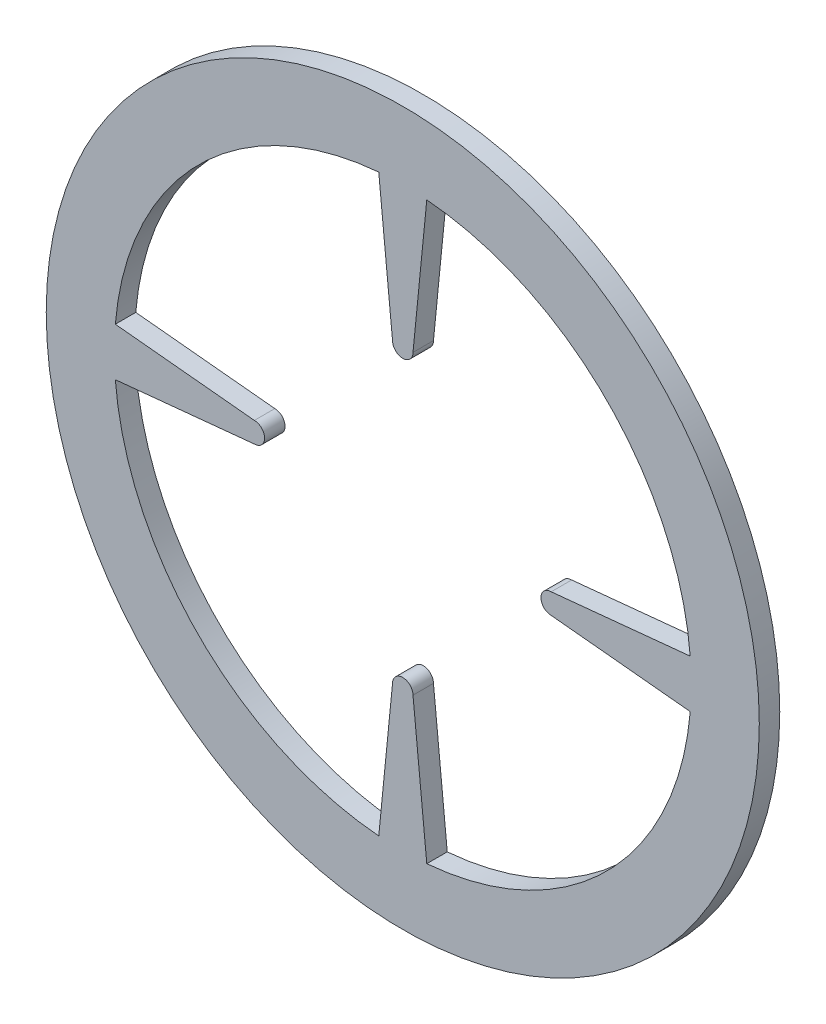
ISO-10303-21;
HEADER;
FILE_DESCRIPTION(('STEP AP214'),'2;1');
FILE_NAME('part.step','',(''),(''),'','','');
FILE_SCHEMA(('AUTOMOTIVE_DESIGN { 1 0 10303 214 1 1 1 1 }'));
ENDSEC;
DATA;
#1=APPLICATION_CONTEXT('core data for automotive mechanical design processes');
#2=APPLICATION_PROTOCOL_DEFINITION('international standard','automotive_design',2000,#1);
#3=PRODUCT_CONTEXT('',#1,'mechanical');
#4=PRODUCT('Part','Part','',(#3));
#5=PRODUCT_RELATED_PRODUCT_CATEGORY('part','',(#4));
#6=PRODUCT_DEFINITION_FORMATION('','',#4);
#7=PRODUCT_DEFINITION_CONTEXT('part definition',#1,'design');
#8=PRODUCT_DEFINITION('design','',#6,#7);
#9=PRODUCT_DEFINITION_SHAPE('','',#8);
#10=(LENGTH_UNIT() NAMED_UNIT(*) SI_UNIT(.MILLI.,.METRE.));
#11=(NAMED_UNIT(*) PLANE_ANGLE_UNIT() SI_UNIT($,.RADIAN.));
#12=(NAMED_UNIT(*) SI_UNIT($,.STERADIAN.) SOLID_ANGLE_UNIT());
#13=UNCERTAINTY_MEASURE_WITH_UNIT(LENGTH_MEASURE(1.E-05),#10,'distance_accuracy_value','');
#14=(GEOMETRIC_REPRESENTATION_CONTEXT(3) GLOBAL_UNCERTAINTY_ASSIGNED_CONTEXT((#13)) GLOBAL_UNIT_ASSIGNED_CONTEXT((#10,
#11,#12)) REPRESENTATION_CONTEXT('',''));
#15=CARTESIAN_POINT('',(0.,0.,0.));
#16=DIRECTION('',(0.,0.,1.));
#17=DIRECTION('',(1.,0.,0.));
#18=AXIS2_PLACEMENT_3D('',#15,#16,#17);
#19=CARTESIAN_POINT('',(0.,0.,0.06));
#20=DIRECTION('',(0.,0.,-1.));
#21=DIRECTION('',(-1.,0.,0.));
#22=AXIS2_PLACEMENT_3D('',#19,#20,#21);
#23=CYLINDRICAL_SURFACE('',#22,1.045);
#24=CARTESIAN_POINT('',(0.,0.,0.06));
#25=DIRECTION('',(0.,0.,1.));
#26=DIRECTION('',(1.,0.,0.));
#27=AXIS2_PLACEMENT_3D('',#24,#25,#26);
#28=CIRCLE('',#27,1.045);
#29=CARTESIAN_POINT('',(1.045,0.,0.06));
#30=VERTEX_POINT('',#29);
#31=EDGE_CURVE('E277',#30,#30,#28,.T.);
#32=ORIENTED_EDGE('',*,*,#31,.F.);
#33=EDGE_LOOP('',(#32));
#34=FACE_BOUND('',#33,.T.);
#35=CARTESIAN_POINT('',(0.,0.,0.));
#36=DIRECTION('',(0.,0.,1.));
#37=DIRECTION('',(1.,0.,0.));
#38=AXIS2_PLACEMENT_3D('',#35,#36,#37);
#39=CIRCLE('',#38,1.045);
#40=CARTESIAN_POINT('',(1.045,0.,0.));
#41=VERTEX_POINT('',#40);
#42=EDGE_CURVE('E265',#41,#41,#39,.T.);
#43=ORIENTED_EDGE('',*,*,#42,.T.);
#44=EDGE_LOOP('',(#43));
#45=FACE_BOUND('',#44,.T.);
#46=ADVANCED_FACE('F88',(#34,#45),#23,.T.);
#47=CARTESIAN_POINT('',(-0.01298454081632,-0.00128687487735681,0.06));
#48=DIRECTION('',(0.995124665732408,0.0986250457589971,0.));
#49=DIRECTION('',(-0.0986250457589971,0.995124665732408,0.));
#50=AXIS2_PLACEMENT_3D('',#47,#48,#49);
#51=PLANE('',#50);
#52=DIRECTION('',(0.0986250457589971,-0.995124665732408,0.));
#53=VECTOR('',#52,1.);
#54=CARTESIAN_POINT('',(-0.01298454081632,-0.00128687487735681,0.));
#55=LINE('',#54,#53);
#56=CARTESIAN_POINT('',(0.0299999999999969,-0.435000000000001,0.));
#57=VERTEX_POINT('',#56);
#58=CARTESIAN_POINT('',(0.0703881485507596,-0.842515581025341,0.));
#59=VERTEX_POINT('',#58);
#60=EDGE_CURVE('E283',#57,#59,#55,.T.);
#61=ORIENTED_EDGE('',*,*,#60,.F.);
#62=DIRECTION('',(0.,0.,-1.));
#63=VECTOR('',#62,1.);
#64=CARTESIAN_POINT('',(0.0299999999999969,-0.435000000000001,0.06));
#65=LINE('',#64,#63);
#66=CARTESIAN_POINT('',(0.0299999999999969,-0.435000000000001,0.06));
#67=VERTEX_POINT('',#66);
#68=EDGE_CURVE('E197',#67,#57,#65,.T.);
#69=ORIENTED_EDGE('',*,*,#68,.F.);
#70=DIRECTION('',(0.0986250457589971,-0.995124665732408,0.));
#71=VECTOR('',#70,1.);
#72=CARTESIAN_POINT('',(-0.01298454081632,-0.00128687487735681,0.06));
#73=LINE('',#72,#71);
#74=CARTESIAN_POINT('',(0.0703881485507596,-0.842515581025341,0.06));
#75=VERTEX_POINT('',#74);
#76=EDGE_CURVE('E268',#67,#75,#73,.T.);
#77=ORIENTED_EDGE('',*,*,#76,.T.);
#78=DIRECTION('',(0.,0.,-1.));
#79=VECTOR('',#78,1.);
#80=CARTESIAN_POINT('',(0.0703881485507596,-0.842515581025341,0.06));
#81=LINE('',#80,#79);
#82=EDGE_CURVE('E194',#75,#59,#81,.T.);
#83=ORIENTED_EDGE('',*,*,#82,.T.);
#84=EDGE_LOOP('',(#61,#69,#77,#83));
#85=FACE_BOUND('',#84,.T.);
#86=ADVANCED_FACE('F315',(#85),#51,.T.);
#87=CARTESIAN_POINT('',(0.,-0.435000000000001,0.06));
#88=DIRECTION('',(0.,0.,-1.));
#89=DIRECTION('',(-1.,0.,0.));
#90=AXIS2_PLACEMENT_3D('',#87,#88,#89);
#91=CYLINDRICAL_SURFACE('',#90,0.03);
#92=CARTESIAN_POINT('',(0.,-0.435000000000001,0.));
#93=DIRECTION('',(0.,0.,1.));
#94=DIRECTION('',(1.,0.,0.));
#95=AXIS2_PLACEMENT_3D('',#92,#93,#94);
#96=CIRCLE('',#95,0.03);
#97=CARTESIAN_POINT('',(-0.030000000000003,-0.435000000000001,0.));
#98=VERTEX_POINT('',#97);
#99=EDGE_CURVE('E287',#57,#98,#96,.T.);
#100=ORIENTED_EDGE('',*,*,#99,.T.);
#101=DIRECTION('',(0.,0.,-1.));
#102=VECTOR('',#101,1.);
#103=CARTESIAN_POINT('',(-0.030000000000003,-0.435000000000001,0.06));
#104=LINE('',#103,#102);
#105=CARTESIAN_POINT('',(-0.030000000000003,-0.435000000000001,0.06));
#106=VERTEX_POINT('',#105);
#107=EDGE_CURVE('E297',#106,#98,#104,.T.);
#108=ORIENTED_EDGE('',*,*,#107,.F.);
#109=CARTESIAN_POINT('',(0.,-0.435000000000001,0.06));
#110=DIRECTION('',(0.,0.,1.));
#111=DIRECTION('',(1.,0.,0.));
#112=AXIS2_PLACEMENT_3D('',#109,#110,#111);
#113=CIRCLE('',#112,0.03);
#114=EDGE_CURVE('E271',#67,#106,#113,.T.);
#115=ORIENTED_EDGE('',*,*,#114,.F.);
#116=ORIENTED_EDGE('',*,*,#68,.T.);
#117=EDGE_LOOP('',(#100,#108,#115,#116));
#118=FACE_BOUND('',#117,.T.);
#119=ADVANCED_FACE('F305',(#118),#91,.T.);
#120=CARTESIAN_POINT('',(0.01298454081632,-0.00128687487735699,0.06));
#121=DIRECTION('',(0.995124665732406,-0.098625045759011,0.));
#122=DIRECTION('',(0.098625045759011,0.995124665732406,0.));
#123=AXIS2_PLACEMENT_3D('',#120,#121,#122);
#124=PLANE('',#123);
#125=DIRECTION('',(-0.098625045759011,-0.995124665732406,0.));
#126=VECTOR('',#125,1.);
#127=CARTESIAN_POINT('',(0.01298454081632,-0.00128687487735699,0.));
#128=LINE('',#127,#126);
#129=CARTESIAN_POINT('',(-0.0703881485507713,-0.84251558102534,0.));
#130=VERTEX_POINT('',#129);
#131=EDGE_CURVE('E290',#98,#130,#128,.T.);
#132=ORIENTED_EDGE('',*,*,#131,.T.);
#133=DIRECTION('',(0.,0.,-1.));
#134=VECTOR('',#133,1.);
#135=CARTESIAN_POINT('',(-0.0703881485507713,-0.84251558102534,0.06));
#136=LINE('',#135,#134);
#137=CARTESIAN_POINT('',(-0.0703881485507713,-0.84251558102534,0.06));
#138=VERTEX_POINT('',#137);
#139=EDGE_CURVE('E280',#138,#130,#136,.T.);
#140=ORIENTED_EDGE('',*,*,#139,.F.);
#141=DIRECTION('',(-0.098625045759011,-0.995124665732406,0.));
#142=VECTOR('',#141,1.);
#143=CARTESIAN_POINT('',(0.01298454081632,-0.00128687487735699,0.06));
#144=LINE('',#143,#142);
#145=EDGE_CURVE('E274',#106,#138,#144,.T.);
#146=ORIENTED_EDGE('',*,*,#145,.F.);
#147=ORIENTED_EDGE('',*,*,#107,.T.);
#148=EDGE_LOOP('',(#132,#140,#146,#147));
#149=FACE_BOUND('',#148,.T.);
#150=ADVANCED_FACE('F383',(#149),#124,.F.);
#151=CARTESIAN_POINT('',(0.,0.,0.06));
#152=DIRECTION('',(0.,0.,-1.));
#153=DIRECTION('',(-1.,0.,0.));
#154=AXIS2_PLACEMENT_3D('',#151,#152,#153);
#155=CYLINDRICAL_SURFACE('',#154,0.845450764815357);
#156=DIRECTION('',(0.,0.,-1.));
#157=VECTOR('',#156,1.);
#158=CARTESIAN_POINT('',(-0.842515581025341,-0.0703881485507566,0.06));
#159=LINE('',#158,#157);
#160=CARTESIAN_POINT('',(-0.842515581025341,-0.0703881485507566,0.06));
#161=VERTEX_POINT('',#160);
#162=CARTESIAN_POINT('',(-0.842515581025342,-0.0703881485507564,0.));
#163=VERTEX_POINT('',#162);
#164=EDGE_CURVE('E98',#161,#163,#159,.T.);
#165=ORIENTED_EDGE('',*,*,#164,.F.);
#166=CARTESIAN_POINT('',(0.,0.,0.06));
#167=DIRECTION('',(0.,0.,1.));
#168=DIRECTION('',(1.,0.,0.));
#169=AXIS2_PLACEMENT_3D('',#166,#167,#168);
#170=CIRCLE('',#169,0.845450764815357);
#171=EDGE_CURVE('E262',#161,#138,#170,.T.);
#172=ORIENTED_EDGE('',*,*,#171,.T.);
#173=ORIENTED_EDGE('',*,*,#139,.T.);
#174=CARTESIAN_POINT('',(0.,0.,0.));
#175=DIRECTION('',(0.,0.,1.));
#176=DIRECTION('',(1.,0.,0.));
#177=AXIS2_PLACEMENT_3D('',#174,#175,#176);
#178=CIRCLE('',#177,0.845450764815357);
#179=EDGE_CURVE('E225',#163,#130,#178,.T.);
#180=ORIENTED_EDGE('',*,*,#179,.F.);
#181=EDGE_LOOP('',(#165,#172,#173,#180));
#182=FACE_BOUND('',#181,.T.);
#183=ADVANCED_FACE('F386',(#182),#155,.F.);
#184=CARTESIAN_POINT('',(-0.0703881485507654,0.842515581025341,0.06));
#185=VERTEX_POINT('',#184);
#186=CARTESIAN_POINT('',(-0.84251558102534,0.0703881485507743,0.06));
#187=VERTEX_POINT('',#186);
#188=EDGE_CURVE('E256',#185,#187,#170,.T.);
#189=ORIENTED_EDGE('',*,*,#188,.T.);
#190=DIRECTION('',(0.,0.,-1.));
#191=VECTOR('',#190,1.);
#192=CARTESIAN_POINT('',(-0.84251558102534,0.0703881485507743,0.06));
#193=LINE('',#192,#191);
#194=CARTESIAN_POINT('',(-0.84251558102534,0.0703881485507743,0.));
#195=VERTEX_POINT('',#194);
#196=EDGE_CURVE('E12',#187,#195,#193,.T.);
#197=ORIENTED_EDGE('',*,*,#196,.T.);
#198=CARTESIAN_POINT('',(-0.0703881485507655,0.842515581025341,0.));
#199=VERTEX_POINT('',#198);
#200=EDGE_CURVE('E415',#199,#195,#178,.T.);
#201=ORIENTED_EDGE('',*,*,#200,.F.);
#202=DIRECTION('',(0.,0.,-1.));
#203=VECTOR('',#202,1.);
#204=CARTESIAN_POINT('',(-0.0703881485507654,0.842515581025341,0.06));
#205=LINE('',#204,#203);
#206=EDGE_CURVE('E178',#185,#199,#205,.T.);
#207=ORIENTED_EDGE('',*,*,#206,.F.);
#208=EDGE_LOOP('',(#189,#197,#201,#207));
#209=FACE_BOUND('',#208,.T.);
#210=ADVANCED_FACE('F392',(#209),#155,.F.);
#211=DIRECTION('',(0.,0.,-1.));
#212=VECTOR('',#211,1.);
#213=CARTESIAN_POINT('',(0.842515581025341,0.0703881485507625,0.06));
#214=LINE('',#213,#212);
#215=CARTESIAN_POINT('',(0.842515581025341,0.0703881485507625,0.06));
#216=VERTEX_POINT('',#215);
#217=CARTESIAN_POINT('',(0.842515581025341,0.0703881485507625,0.));
#218=VERTEX_POINT('',#217);
#219=EDGE_CURVE('E185',#216,#218,#214,.T.);
#220=ORIENTED_EDGE('',*,*,#219,.F.);
#221=CARTESIAN_POINT('',(0.0703881485507655,0.842515581025341,0.06));
#222=VERTEX_POINT('',#221);
#223=EDGE_CURVE('E261',#216,#222,#170,.T.);
#224=ORIENTED_EDGE('',*,*,#223,.T.);
#225=DIRECTION('',(0.,0.,-1.));
#226=VECTOR('',#225,1.);
#227=CARTESIAN_POINT('',(0.0703881485507655,0.842515581025341,0.06));
#228=LINE('',#227,#226);
#229=CARTESIAN_POINT('',(0.0703881485507654,0.842515581025341,0.));
#230=VERTEX_POINT('',#229);
#231=EDGE_CURVE('E183',#222,#230,#228,.T.);
#232=ORIENTED_EDGE('',*,*,#231,.T.);
#233=EDGE_CURVE('E284',#218,#230,#178,.T.);
#234=ORIENTED_EDGE('',*,*,#233,.F.);
#235=EDGE_LOOP('',(#220,#224,#232,#234));
#236=FACE_BOUND('',#235,.T.);
#237=ADVANCED_FACE('F350',(#236),#155,.F.);
#238=CARTESIAN_POINT('',(0.84251558102534,-0.0703881485507684,0.06));
#239=VERTEX_POINT('',#238);
#240=EDGE_CURVE('E264',#75,#239,#170,.T.);
#241=ORIENTED_EDGE('',*,*,#240,.T.);
#242=DIRECTION('',(0.,0.,-1.));
#243=VECTOR('',#242,1.);
#244=CARTESIAN_POINT('',(0.842515581025341,-0.0703881485507684,0.06));
#245=LINE('',#244,#243);
#246=CARTESIAN_POINT('',(0.842515581025341,-0.0703881485507684,0.));
#247=VERTEX_POINT('',#246);
#248=EDGE_CURVE('E192',#239,#247,#245,.T.);
#249=ORIENTED_EDGE('',*,*,#248,.T.);
#250=EDGE_CURVE('E281',#59,#247,#178,.T.);
#251=ORIENTED_EDGE('',*,*,#250,.F.);
#252=ORIENTED_EDGE('',*,*,#82,.F.);
#253=EDGE_LOOP('',(#241,#249,#251,#252));
#254=FACE_BOUND('',#253,.T.);
#255=ADVANCED_FACE('F321',(#254),#155,.F.);
#256=CARTESIAN_POINT('',(0.,0.,0.));
#257=DIRECTION('',(0.,0.,1.));
#258=DIRECTION('',(1.,0.,0.));
#259=AXIS2_PLACEMENT_3D('',#256,#257,#258);
#260=PLANE('',#259);
#261=ORIENTED_EDGE('',*,*,#250,.T.);
#262=DIRECTION('',(0.995124665732407,-0.0986250457590075,0.));
#263=VECTOR('',#262,1.);
#264=CARTESIAN_POINT('',(0.435000000000001,-0.0300000000000015,0.));
#265=LINE('',#264,#263);
#266=CARTESIAN_POINT('',(0.435000000000001,-0.0300000000000015,0.));
#267=VERTEX_POINT('',#266);
#268=EDGE_CURVE('E240',#267,#247,#265,.T.);
#269=ORIENTED_EDGE('',*,*,#268,.F.);
#270=CARTESIAN_POINT('',(0.435000000000001,0.,0.));
#271=DIRECTION('',(0.,0.,1.));
#272=DIRECTION('',(1.,0.,0.));
#273=AXIS2_PLACEMENT_3D('',#270,#271,#272);
#274=CIRCLE('',#273,0.03);
#275=CARTESIAN_POINT('',(0.435000000000001,0.0299999999999985,0.));
#276=VERTEX_POINT('',#275);
#277=EDGE_CURVE('E237',#276,#267,#274,.T.);
#278=ORIENTED_EDGE('',*,*,#277,.F.);
#279=DIRECTION('',(0.995124665732407,0.0986250457590006,0.));
#280=VECTOR('',#279,1.);
#281=CARTESIAN_POINT('',(0.435000000000001,0.0299999999999985,0.));
#282=LINE('',#281,#280);
#283=EDGE_CURVE('E230',#276,#218,#282,.T.);
#284=ORIENTED_EDGE('',*,*,#283,.T.);
#285=ORIENTED_EDGE('',*,*,#233,.T.);
#286=DIRECTION('',(0.0986250457590041,0.995124665732407,0.));
#287=VECTOR('',#286,1.);
#288=CARTESIAN_POINT('',(0.03,0.435000000000001,0.));
#289=LINE('',#288,#287);
#290=CARTESIAN_POINT('',(0.03,0.435000000000001,0.));
#291=VERTEX_POINT('',#290);
#292=EDGE_CURVE('E149',#291,#230,#289,.T.);
#293=ORIENTED_EDGE('',*,*,#292,.F.);
#294=CARTESIAN_POINT('',(0.,0.435000000000001,0.));
#295=DIRECTION('',(0.,0.,1.));
#296=DIRECTION('',(1.,0.,0.));
#297=AXIS2_PLACEMENT_3D('',#294,#295,#296);
#298=CIRCLE('',#297,0.03);
#299=CARTESIAN_POINT('',(-0.03,0.435000000000001,0.));
#300=VERTEX_POINT('',#299);
#301=EDGE_CURVE('E157',#300,#291,#298,.T.);
#302=ORIENTED_EDGE('',*,*,#301,.F.);
#303=DIRECTION('',(-0.0986250457590041,0.995124665732407,0.));
#304=VECTOR('',#303,1.);
#305=CARTESIAN_POINT('',(-0.03,0.435000000000001,0.));
#306=LINE('',#305,#304);
#307=EDGE_CURVE('E172',#300,#199,#306,.T.);
#308=ORIENTED_EDGE('',*,*,#307,.T.);
#309=ORIENTED_EDGE('',*,*,#200,.T.);
#310=DIRECTION('',(-0.995124665732406,0.0986250457590145,0.));
#311=VECTOR('',#310,1.);
#312=CARTESIAN_POINT('',(-0.435,0.0300000000000045,0.));
#313=LINE('',#312,#311);
#314=CARTESIAN_POINT('',(-0.435,0.0300000000000045,0.));
#315=VERTEX_POINT('',#314);
#316=EDGE_CURVE('E215',#315,#195,#313,.T.);
#317=ORIENTED_EDGE('',*,*,#316,.F.);
#318=CARTESIAN_POINT('',(-0.435000000000001,0.,0.));
#319=DIRECTION('',(0.,0.,1.));
#320=DIRECTION('',(1.,0.,0.));
#321=AXIS2_PLACEMENT_3D('',#318,#319,#320);
#322=CIRCLE('',#321,0.03);
#323=CARTESIAN_POINT('',(-0.435000000000001,-0.0299999999999954,0.));
#324=VERTEX_POINT('',#323);
#325=EDGE_CURVE('E212',#324,#315,#322,.T.);
#326=ORIENTED_EDGE('',*,*,#325,.F.);
#327=DIRECTION('',(-0.995124665732408,-0.0986250457589936,0.));
#328=VECTOR('',#327,1.);
#329=CARTESIAN_POINT('',(-0.435000000000001,-0.0299999999999954,0.));
#330=LINE('',#329,#328);
#331=EDGE_CURVE('E206',#324,#163,#330,.T.);
#332=ORIENTED_EDGE('',*,*,#331,.T.);
#333=ORIENTED_EDGE('',*,*,#179,.T.);
#334=ORIENTED_EDGE('',*,*,#131,.F.);
#335=ORIENTED_EDGE('',*,*,#99,.F.);
#336=ORIENTED_EDGE('',*,*,#60,.T.);
#337=EDGE_LOOP('',(#261,#269,#278,#284,#285,#293,#302,#308,#309,#317,#326,#332,#333,#334,#335,#336));
#338=FACE_BOUND('',#337,.T.);
#339=ORIENTED_EDGE('',*,*,#42,.F.);
#340=EDGE_LOOP('',(#339));
#341=FACE_BOUND('',#340,.T.);
#342=ADVANCED_FACE('F168',(#338,#341),#260,.F.);
#343=CARTESIAN_POINT('',(0.,0.,0.06));
#344=DIRECTION('',(0.,0.,1.));
#345=DIRECTION('',(1.,0.,0.));
#346=AXIS2_PLACEMENT_3D('',#343,#344,#345);
#347=PLANE('',#346);
#348=ORIENTED_EDGE('',*,*,#240,.F.);
#349=ORIENTED_EDGE('',*,*,#76,.F.);
#350=ORIENTED_EDGE('',*,*,#114,.T.);
#351=ORIENTED_EDGE('',*,*,#145,.T.);
#352=ORIENTED_EDGE('',*,*,#171,.F.);
#353=DIRECTION('',(-0.995124665732408,-0.0986250457589936,0.));
#354=VECTOR('',#353,1.);
#355=CARTESIAN_POINT('',(-0.435000000000001,-0.0299999999999954,0.06));
#356=LINE('',#355,#354);
#357=CARTESIAN_POINT('',(-0.435000000000001,-0.0299999999999954,0.06));
#358=VERTEX_POINT('',#357);
#359=EDGE_CURVE('E209',#358,#161,#356,.T.);
#360=ORIENTED_EDGE('',*,*,#359,.F.);
#361=CARTESIAN_POINT('',(-0.435000000000001,0.,0.06));
#362=DIRECTION('',(0.,0.,1.));
#363=DIRECTION('',(1.,0.,0.));
#364=AXIS2_PLACEMENT_3D('',#361,#362,#363);
#365=CIRCLE('',#364,0.03);
#366=CARTESIAN_POINT('',(-0.435,0.0300000000000045,0.06));
#367=VERTEX_POINT('',#366);
#368=EDGE_CURVE('E202',#358,#367,#365,.T.);
#369=ORIENTED_EDGE('',*,*,#368,.T.);
#370=DIRECTION('',(-0.995124665732406,0.0986250457590145,0.));
#371=VECTOR('',#370,1.);
#372=CARTESIAN_POINT('',(-0.435,0.0300000000000045,0.06));
#373=LINE('',#372,#371);
#374=EDGE_CURVE('E205',#367,#187,#373,.T.);
#375=ORIENTED_EDGE('',*,*,#374,.T.);
#376=ORIENTED_EDGE('',*,*,#188,.F.);
#377=DIRECTION('',(-0.0986250457590041,0.995124665732407,0.));
#378=VECTOR('',#377,1.);
#379=CARTESIAN_POINT('',(-0.03,0.435000000000001,0.06));
#380=LINE('',#379,#378);
#381=CARTESIAN_POINT('',(-0.03,0.435000000000001,0.06));
#382=VERTEX_POINT('',#381);
#383=EDGE_CURVE('E164',#382,#185,#380,.T.);
#384=ORIENTED_EDGE('',*,*,#383,.F.);
#385=CARTESIAN_POINT('',(0.,0.435000000000001,0.06));
#386=DIRECTION('',(0.,0.,1.));
#387=DIRECTION('',(1.,0.,0.));
#388=AXIS2_PLACEMENT_3D('',#385,#386,#387);
#389=CIRCLE('',#388,0.03);
#390=CARTESIAN_POINT('',(0.03,0.435000000000001,0.06));
#391=VERTEX_POINT('',#390);
#392=EDGE_CURVE('E159',#382,#391,#389,.T.);
#393=ORIENTED_EDGE('',*,*,#392,.T.);
#394=DIRECTION('',(0.0986250457590041,0.995124665732407,0.));
#395=VECTOR('',#394,1.);
#396=CARTESIAN_POINT('',(0.03,0.435000000000001,0.06));
#397=LINE('',#396,#395);
#398=EDGE_CURVE('E180',#391,#222,#397,.T.);
#399=ORIENTED_EDGE('',*,*,#398,.T.);
#400=ORIENTED_EDGE('',*,*,#223,.F.);
#401=DIRECTION('',(0.995124665732407,0.0986250457590006,0.));
#402=VECTOR('',#401,1.);
#403=CARTESIAN_POINT('',(0.435000000000001,0.0299999999999985,0.06));
#404=LINE('',#403,#402);
#405=CARTESIAN_POINT('',(0.435000000000001,0.0299999999999985,0.06));
#406=VERTEX_POINT('',#405);
#407=EDGE_CURVE('E233',#406,#216,#404,.T.);
#408=ORIENTED_EDGE('',*,*,#407,.F.);
#409=CARTESIAN_POINT('',(0.435000000000001,0.,0.06));
#410=DIRECTION('',(0.,0.,1.));
#411=DIRECTION('',(1.,0.,0.));
#412=AXIS2_PLACEMENT_3D('',#409,#410,#411);
#413=CIRCLE('',#412,0.03);
#414=CARTESIAN_POINT('',(0.435000000000001,-0.0300000000000015,0.06));
#415=VERTEX_POINT('',#414);
#416=EDGE_CURVE('E226',#406,#415,#413,.T.);
#417=ORIENTED_EDGE('',*,*,#416,.T.);
#418=DIRECTION('',(0.995124665732407,-0.0986250457590075,0.));
#419=VECTOR('',#418,1.);
#420=CARTESIAN_POINT('',(0.435000000000001,-0.0300000000000015,0.06));
#421=LINE('',#420,#419);
#422=EDGE_CURVE('E229',#415,#239,#421,.T.);
#423=ORIENTED_EDGE('',*,*,#422,.T.);
#424=EDGE_LOOP('',(#348,#349,#350,#351,#352,#360,#369,#375,#376,#384,#393,#399,#400,#408,#417,#423));
#425=FACE_BOUND('',#424,.T.);
#426=ORIENTED_EDGE('',*,*,#31,.T.);
#427=EDGE_LOOP('',(#426));
#428=FACE_BOUND('',#427,.T.);
#429=ADVANCED_FACE('F258',(#425,#428),#347,.T.);
#430=CARTESIAN_POINT('',(0.03,0.435000000000001,0.06));
#431=DIRECTION('',(-0.995124665732407,0.0986250457590041,0.));
#432=DIRECTION('',(-0.0986250457590041,-0.995124665732407,0.));
#433=AXIS2_PLACEMENT_3D('',#430,#431,#432);
#434=PLANE('',#433);
#435=ORIENTED_EDGE('',*,*,#292,.T.);
#436=ORIENTED_EDGE('',*,*,#231,.F.);
#437=ORIENTED_EDGE('',*,*,#398,.F.);
#438=DIRECTION('',(0.,0.,-1.));
#439=VECTOR('',#438,1.);
#440=CARTESIAN_POINT('',(0.03,0.435000000000001,0.06));
#441=LINE('',#440,#439);
#442=EDGE_CURVE('E92',#391,#291,#441,.T.);
#443=ORIENTED_EDGE('',*,*,#442,.T.);
#444=EDGE_LOOP('',(#435,#436,#437,#443));
#445=FACE_BOUND('',#444,.T.);
#446=ADVANCED_FACE('F347',(#445),#434,.F.);
#447=CARTESIAN_POINT('',(-0.03,0.435000000000001,0.06));
#448=DIRECTION('',(-0.995124665732407,-0.0986250457590041,0.));
#449=DIRECTION('',(0.0986250457590041,-0.995124665732407,0.));
#450=AXIS2_PLACEMENT_3D('',#447,#448,#449);
#451=PLANE('',#450);
#452=ORIENTED_EDGE('',*,*,#307,.F.);
#453=DIRECTION('',(0.,0.,-1.));
#454=VECTOR('',#453,1.);
#455=CARTESIAN_POINT('',(-0.03,0.435000000000001,0.06));
#456=LINE('',#455,#454);
#457=EDGE_CURVE('E155',#382,#300,#456,.T.);
#458=ORIENTED_EDGE('',*,*,#457,.F.);
#459=ORIENTED_EDGE('',*,*,#383,.T.);
#460=ORIENTED_EDGE('',*,*,#206,.T.);
#461=EDGE_LOOP('',(#452,#458,#459,#460));
#462=FACE_BOUND('',#461,.T.);
#463=ADVANCED_FACE('F176',(#462),#451,.T.);
#464=CARTESIAN_POINT('',(0.,0.435000000000001,0.06));
#465=DIRECTION('',(0.,0.,-1.));
#466=DIRECTION('',(-1.,0.,0.));
#467=AXIS2_PLACEMENT_3D('',#464,#465,#466);
#468=CYLINDRICAL_SURFACE('',#467,0.03);
#469=ORIENTED_EDGE('',*,*,#301,.T.);
#470=ORIENTED_EDGE('',*,*,#442,.F.);
#471=ORIENTED_EDGE('',*,*,#392,.F.);
#472=ORIENTED_EDGE('',*,*,#457,.T.);
#473=EDGE_LOOP('',(#469,#470,#471,#472));
#474=FACE_BOUND('',#473,.T.);
#475=ADVANCED_FACE('F90',(#474),#468,.T.);
#476=CARTESIAN_POINT('',(0.435000000000001,-0.0300000000000015,0.06));
#477=DIRECTION('',(0.0986250457590075,0.995124665732407,0.));
#478=DIRECTION('',(-0.995124665732407,0.0986250457590075,0.));
#479=AXIS2_PLACEMENT_3D('',#476,#477,#478);
#480=PLANE('',#479);
#481=ORIENTED_EDGE('',*,*,#268,.T.);
#482=ORIENTED_EDGE('',*,*,#248,.F.);
#483=ORIENTED_EDGE('',*,*,#422,.F.);
#484=DIRECTION('',(0.,0.,-1.));
#485=VECTOR('',#484,1.);
#486=CARTESIAN_POINT('',(0.435000000000001,-0.0300000000000015,0.06));
#487=LINE('',#486,#485);
#488=EDGE_CURVE('E216',#415,#267,#487,.T.);
#489=ORIENTED_EDGE('',*,*,#488,.T.);
#490=EDGE_LOOP('',(#481,#482,#483,#489));
#491=FACE_BOUND('',#490,.T.);
#492=ADVANCED_FACE('F359',(#491),#480,.F.);
#493=CARTESIAN_POINT('',(0.435000000000001,0.0299999999999985,0.06));
#494=DIRECTION('',(-0.0986250457590006,0.995124665732407,0.));
#495=DIRECTION('',(-0.995124665732407,-0.0986250457590006,0.));
#496=AXIS2_PLACEMENT_3D('',#493,#494,#495);
#497=PLANE('',#496);
#498=ORIENTED_EDGE('',*,*,#283,.F.);
#499=DIRECTION('',(0.,0.,-1.));
#500=VECTOR('',#499,1.);
#501=CARTESIAN_POINT('',(0.435000000000001,0.0299999999999985,0.06));
#502=LINE('',#501,#500);
#503=EDGE_CURVE('E236',#406,#276,#502,.T.);
#504=ORIENTED_EDGE('',*,*,#503,.F.);
#505=ORIENTED_EDGE('',*,*,#407,.T.);
#506=ORIENTED_EDGE('',*,*,#219,.T.);
#507=EDGE_LOOP('',(#498,#504,#505,#506));
#508=FACE_BOUND('',#507,.T.);
#509=ADVANCED_FACE('F353',(#508),#497,.T.);
#510=CARTESIAN_POINT('',(0.435000000000001,0.,0.06));
#511=DIRECTION('',(0.,0.,-1.));
#512=DIRECTION('',(-1.,0.,0.));
#513=AXIS2_PLACEMENT_3D('',#510,#511,#512);
#514=CYLINDRICAL_SURFACE('',#513,0.03);
#515=ORIENTED_EDGE('',*,*,#277,.T.);
#516=ORIENTED_EDGE('',*,*,#488,.F.);
#517=ORIENTED_EDGE('',*,*,#416,.F.);
#518=ORIENTED_EDGE('',*,*,#503,.T.);
#519=EDGE_LOOP('',(#515,#516,#517,#518));
#520=FACE_BOUND('',#519,.T.);
#521=ADVANCED_FACE('F357',(#520),#514,.T.);
#522=CARTESIAN_POINT('',(-0.435,0.0300000000000045,0.06));
#523=DIRECTION('',(-0.0986250457590145,-0.995124665732406,0.));
#524=DIRECTION('',(0.995124665732406,-0.0986250457590145,0.));
#525=AXIS2_PLACEMENT_3D('',#522,#523,#524);
#526=PLANE('',#525);
#527=ORIENTED_EDGE('',*,*,#316,.T.);
#528=ORIENTED_EDGE('',*,*,#196,.F.);
#529=ORIENTED_EDGE('',*,*,#374,.F.);
#530=DIRECTION('',(0.,0.,-1.));
#531=VECTOR('',#530,1.);
#532=CARTESIAN_POINT('',(-0.435,0.0300000000000045,0.06));
#533=LINE('',#532,#531);
#534=EDGE_CURVE('E221',#367,#315,#533,.T.);
#535=ORIENTED_EDGE('',*,*,#534,.T.);
#536=EDGE_LOOP('',(#527,#528,#529,#535));
#537=FACE_BOUND('',#536,.T.);
#538=ADVANCED_FACE('F370',(#537),#526,.F.);
#539=CARTESIAN_POINT('',(-0.435000000000001,-0.0299999999999954,0.06));
#540=DIRECTION('',(0.0986250457589936,-0.995124665732408,0.));
#541=DIRECTION('',(0.995124665732408,0.0986250457589936,0.));
#542=AXIS2_PLACEMENT_3D('',#539,#540,#541);
#543=PLANE('',#542);
#544=ORIENTED_EDGE('',*,*,#331,.F.);
#545=DIRECTION('',(0.,0.,-1.));
#546=VECTOR('',#545,1.);
#547=CARTESIAN_POINT('',(-0.435000000000001,-0.0299999999999954,0.06));
#548=LINE('',#547,#546);
#549=EDGE_CURVE('E211',#358,#324,#548,.T.);
#550=ORIENTED_EDGE('',*,*,#549,.F.);
#551=ORIENTED_EDGE('',*,*,#359,.T.);
#552=ORIENTED_EDGE('',*,*,#164,.T.);
#553=EDGE_LOOP('',(#544,#550,#551,#552));
#554=FACE_BOUND('',#553,.T.);
#555=ADVANCED_FACE('F393',(#554),#543,.T.);
#556=CARTESIAN_POINT('',(-0.435000000000001,0.,0.06));
#557=DIRECTION('',(0.,0.,-1.));
#558=DIRECTION('',(-1.,0.,0.));
#559=AXIS2_PLACEMENT_3D('',#556,#557,#558);
#560=CYLINDRICAL_SURFACE('',#559,0.03);
#561=ORIENTED_EDGE('',*,*,#325,.T.);
#562=ORIENTED_EDGE('',*,*,#534,.F.);
#563=ORIENTED_EDGE('',*,*,#368,.F.);
#564=ORIENTED_EDGE('',*,*,#549,.T.);
#565=EDGE_LOOP('',(#561,#562,#563,#564));
#566=FACE_BOUND('',#565,.T.);
#567=ADVANCED_FACE('F367',(#566),#560,.T.);
#568=CLOSED_SHELL('',(#46,#86,#119,#150,#183,#210,#237,#255,#342,#429,#446,#463,#475,#492,#509,
#521,#538,#555,#567));
#569=MANIFOLD_SOLID_BREP('B2',#568);
#570=ADVANCED_BREP_SHAPE_REPRESENTATION('',(#18,#569),#14);
#571=SHAPE_DEFINITION_REPRESENTATION(#9,#570);
ENDSEC;
END-ISO-10303-21;
